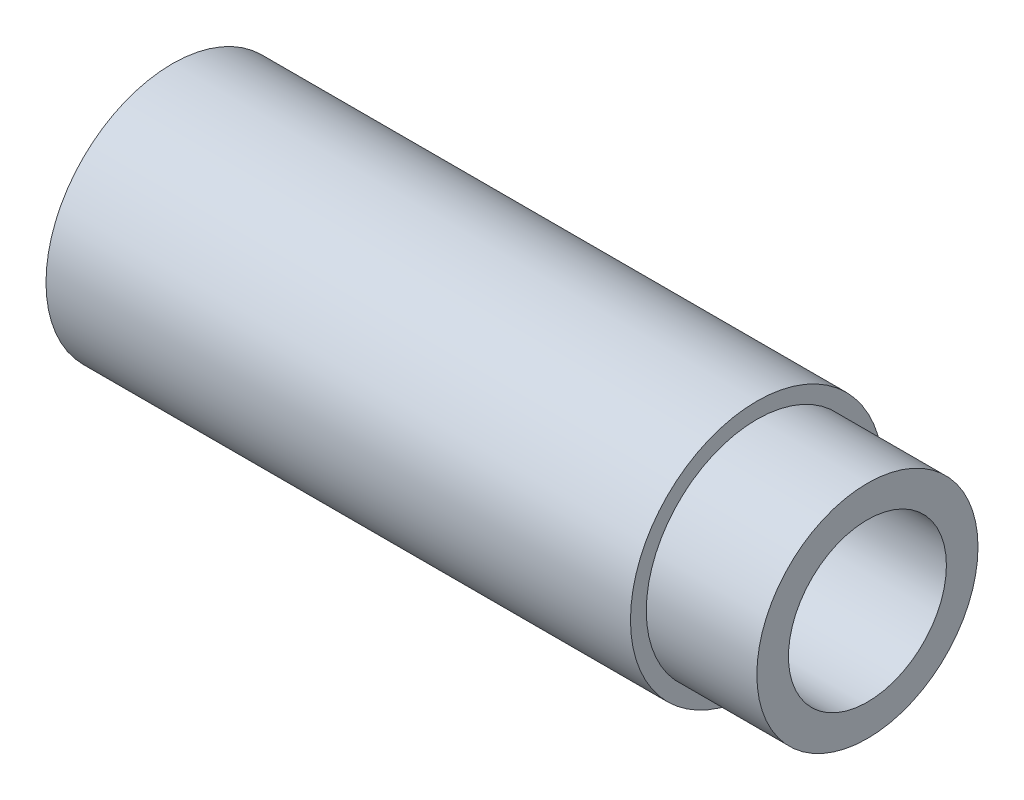
ISO-10303-21;
HEADER;
FILE_DESCRIPTION(('STEP AP214'),'2;1');
FILE_NAME('part.step','',(''),(''),'','','');
FILE_SCHEMA(('AUTOMOTIVE_DESIGN { 1 0 10303 214 1 1 1 1 }'));
ENDSEC;
DATA;
#1=APPLICATION_CONTEXT('core data for automotive mechanical design processes');
#2=APPLICATION_PROTOCOL_DEFINITION('international standard','automotive_design',2000,#1);
#3=PRODUCT_CONTEXT('',#1,'mechanical');
#4=PRODUCT('Part','Part','',(#3));
#5=PRODUCT_RELATED_PRODUCT_CATEGORY('part','',(#4));
#6=PRODUCT_DEFINITION_FORMATION('','',#4);
#7=PRODUCT_DEFINITION_CONTEXT('part definition',#1,'design');
#8=PRODUCT_DEFINITION('design','',#6,#7);
#9=PRODUCT_DEFINITION_SHAPE('','',#8);
#10=(LENGTH_UNIT() NAMED_UNIT(*) SI_UNIT(.MILLI.,.METRE.));
#11=(NAMED_UNIT(*) PLANE_ANGLE_UNIT() SI_UNIT($,.RADIAN.));
#12=(NAMED_UNIT(*) SI_UNIT($,.STERADIAN.) SOLID_ANGLE_UNIT());
#13=UNCERTAINTY_MEASURE_WITH_UNIT(LENGTH_MEASURE(1.E-05),#10,'distance_accuracy_value','');
#14=(GEOMETRIC_REPRESENTATION_CONTEXT(3) GLOBAL_UNCERTAINTY_ASSIGNED_CONTEXT((#13)) GLOBAL_UNIT_ASSIGNED_CONTEXT((#10,
#11,#12)) REPRESENTATION_CONTEXT('',''));
#15=CARTESIAN_POINT('',(0.,0.,0.));
#16=DIRECTION('',(0.,0.,1.));
#17=DIRECTION('',(1.,0.,0.));
#18=AXIS2_PLACEMENT_3D('',#15,#16,#17);
#19=CARTESIAN_POINT('',(0.,2.5,0.));
#20=DIRECTION('',(1.,0.,0.));
#21=DIRECTION('',(0.,0.,-1.));
#22=AXIS2_PLACEMENT_3D('',#19,#20,#21);
#23=PLANE('',#22);
#24=CARTESIAN_POINT('',(0.,0.,0.));
#25=DIRECTION('',(1.,0.,0.));
#26=DIRECTION('',(0.,0.,-1.));
#27=AXIS2_PLACEMENT_3D('',#24,#25,#26);
#28=CIRCLE('',#27,3.5);
#29=CARTESIAN_POINT('',(0.,0.,-3.5));
#30=VERTEX_POINT('',#29);
#31=EDGE_CURVE('E10',#30,#30,#28,.T.);
#32=ORIENTED_EDGE('',*,*,#31,.T.);
#33=EDGE_LOOP('',(#32));
#34=FACE_BOUND('',#33,.T.);
#35=CARTESIAN_POINT('',(0.,0.,0.));
#36=DIRECTION('',(1.,0.,0.));
#37=DIRECTION('',(0.,0.,-1.));
#38=AXIS2_PLACEMENT_3D('',#35,#36,#37);
#39=CIRCLE('',#38,2.5);
#40=CARTESIAN_POINT('',(0.,0.,-2.5));
#41=VERTEX_POINT('',#40);
#42=EDGE_CURVE('E57',#41,#41,#39,.T.);
#43=ORIENTED_EDGE('',*,*,#42,.F.);
#44=EDGE_LOOP('',(#43));
#45=FACE_BOUND('',#44,.T.);
#46=ADVANCED_FACE('F35',(#34,#45),#23,.T.);
#47=CARTESIAN_POINT('',(0.,0.,0.));
#48=DIRECTION('',(1.,0.,0.));
#49=DIRECTION('',(0.,0.,-1.));
#50=AXIS2_PLACEMENT_3D('',#47,#48,#49);
#51=CYLINDRICAL_SURFACE('',#50,3.5);
#52=CARTESIAN_POINT('',(-3.5,0.,0.));
#53=DIRECTION('',(1.,0.,0.));
#54=DIRECTION('',(0.,0.,-1.));
#55=AXIS2_PLACEMENT_3D('',#52,#53,#54);
#56=CIRCLE('',#55,3.5);
#57=CARTESIAN_POINT('',(-3.5,0.,-3.5));
#58=VERTEX_POINT('',#57);
#59=EDGE_CURVE('E41',#58,#58,#56,.T.);
#60=ORIENTED_EDGE('',*,*,#59,.T.);
#61=EDGE_LOOP('',(#60));
#62=FACE_BOUND('',#61,.T.);
#63=ORIENTED_EDGE('',*,*,#31,.F.);
#64=EDGE_LOOP('',(#63));
#65=FACE_BOUND('',#64,.T.);
#66=ADVANCED_FACE('F65',(#62,#65),#51,.T.);
#67=CARTESIAN_POINT('',(-3.5,3.5,0.));
#68=DIRECTION('',(1.,0.,0.));
#69=DIRECTION('',(0.,0.,-1.));
#70=AXIS2_PLACEMENT_3D('',#67,#68,#69);
#71=PLANE('',#70);
#72=CARTESIAN_POINT('',(-3.5,0.,0.));
#73=DIRECTION('',(1.,0.,0.));
#74=DIRECTION('',(0.,0.,-1.));
#75=AXIS2_PLACEMENT_3D('',#72,#73,#74);
#76=CIRCLE('',#75,4.);
#77=CARTESIAN_POINT('',(-3.5,0.,-4.));
#78=VERTEX_POINT('',#77);
#79=EDGE_CURVE('E45',#78,#78,#76,.T.);
#80=ORIENTED_EDGE('',*,*,#79,.T.);
#81=EDGE_LOOP('',(#80));
#82=FACE_BOUND('',#81,.T.);
#83=ORIENTED_EDGE('',*,*,#59,.F.);
#84=EDGE_LOOP('',(#83));
#85=FACE_BOUND('',#84,.T.);
#86=ADVANCED_FACE('F69',(#82,#85),#71,.T.);
#87=CARTESIAN_POINT('',(0.,0.,0.));
#88=DIRECTION('',(1.,0.,0.));
#89=DIRECTION('',(0.,0.,-1.));
#90=AXIS2_PLACEMENT_3D('',#87,#88,#89);
#91=CYLINDRICAL_SURFACE('',#90,4.);
#92=CARTESIAN_POINT('',(-22.,0.,0.));
#93=DIRECTION('',(1.,0.,0.));
#94=DIRECTION('',(0.,0.,-1.));
#95=AXIS2_PLACEMENT_3D('',#92,#93,#94);
#96=CIRCLE('',#95,4.);
#97=CARTESIAN_POINT('',(-22.,0.,-4.));
#98=VERTEX_POINT('',#97);
#99=EDGE_CURVE('E49',#98,#98,#96,.T.);
#100=ORIENTED_EDGE('',*,*,#99,.T.);
#101=EDGE_LOOP('',(#100));
#102=FACE_BOUND('',#101,.T.);
#103=ORIENTED_EDGE('',*,*,#79,.F.);
#104=EDGE_LOOP('',(#103));
#105=FACE_BOUND('',#104,.T.);
#106=ADVANCED_FACE('F73',(#102,#105),#91,.T.);
#107=CARTESIAN_POINT('',(-22.,4.,0.));
#108=DIRECTION('',(-1.,0.,0.));
#109=DIRECTION('',(0.,0.,1.));
#110=AXIS2_PLACEMENT_3D('',#107,#108,#109);
#111=PLANE('',#110);
#112=CARTESIAN_POINT('',(-22.,0.,0.));
#113=DIRECTION('',(1.,0.,0.));
#114=DIRECTION('',(0.,0.,-1.));
#115=AXIS2_PLACEMENT_3D('',#112,#113,#114);
#116=CIRCLE('',#115,2.5);
#117=CARTESIAN_POINT('',(-22.,0.,-2.5));
#118=VERTEX_POINT('',#117);
#119=EDGE_CURVE('E54',#118,#118,#116,.T.);
#120=ORIENTED_EDGE('',*,*,#119,.T.);
#121=EDGE_LOOP('',(#120));
#122=FACE_BOUND('',#121,.T.);
#123=ORIENTED_EDGE('',*,*,#99,.F.);
#124=EDGE_LOOP('',(#123));
#125=FACE_BOUND('',#124,.T.);
#126=ADVANCED_FACE('F80',(#122,#125),#111,.T.);
#127=CARTESIAN_POINT('',(0.,0.,0.));
#128=DIRECTION('',(1.,0.,0.));
#129=DIRECTION('',(0.,0.,-1.));
#130=AXIS2_PLACEMENT_3D('',#127,#128,#129);
#131=CYLINDRICAL_SURFACE('',#130,2.5);
#132=ORIENTED_EDGE('',*,*,#42,.T.);
#133=EDGE_LOOP('',(#132));
#134=FACE_BOUND('',#133,.T.);
#135=ORIENTED_EDGE('',*,*,#119,.F.);
#136=EDGE_LOOP('',(#135));
#137=FACE_BOUND('',#136,.T.);
#138=ADVANCED_FACE('F61',(#134,#137),#131,.F.);
#139=CLOSED_SHELL('',(#46,#66,#86,#106,#126,#138));
#140=MANIFOLD_SOLID_BREP('B2',#139);
#141=ADVANCED_BREP_SHAPE_REPRESENTATION('',(#18,#140),#14);
#142=SHAPE_DEFINITION_REPRESENTATION(#9,#141);
ENDSEC;
END-ISO-10303-21;
